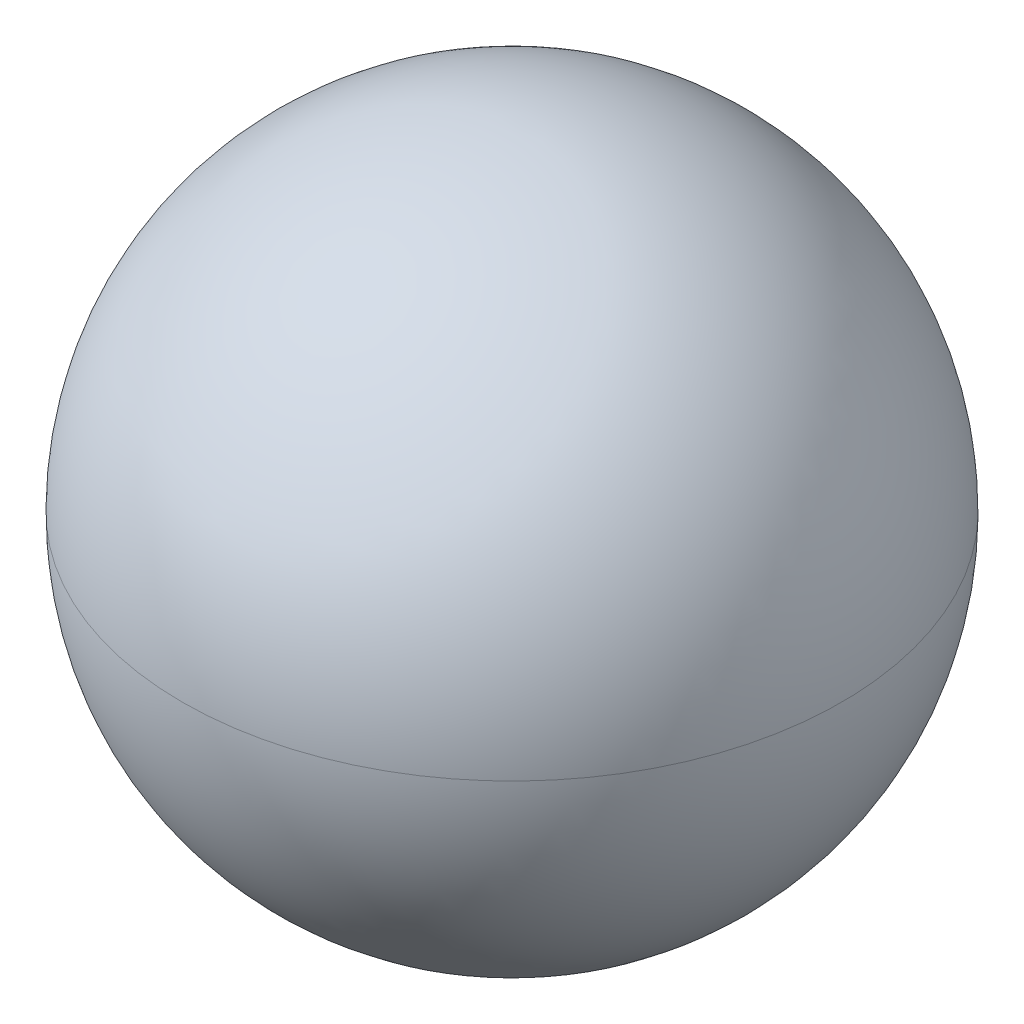
ISO-10303-21;
HEADER;
FILE_DESCRIPTION(('STEP AP214'),'2;1');
FILE_NAME('part.step','',(''),(''),'','','');
FILE_SCHEMA(('AUTOMOTIVE_DESIGN { 1 0 10303 214 1 1 1 1 }'));
ENDSEC;
DATA;
#1=APPLICATION_CONTEXT('core data for automotive mechanical design processes');
#2=APPLICATION_PROTOCOL_DEFINITION('international standard','automotive_design',2000,#1);
#3=PRODUCT_CONTEXT('',#1,'mechanical');
#4=PRODUCT('Part','Part','',(#3));
#5=PRODUCT_RELATED_PRODUCT_CATEGORY('part','',(#4));
#6=PRODUCT_DEFINITION_FORMATION('','',#4);
#7=PRODUCT_DEFINITION_CONTEXT('part definition',#1,'design');
#8=PRODUCT_DEFINITION('design','',#6,#7);
#9=PRODUCT_DEFINITION_SHAPE('','',#8);
#10=(LENGTH_UNIT() NAMED_UNIT(*) SI_UNIT(.MILLI.,.METRE.));
#11=(NAMED_UNIT(*) PLANE_ANGLE_UNIT() SI_UNIT($,.RADIAN.));
#12=(NAMED_UNIT(*) SI_UNIT($,.STERADIAN.) SOLID_ANGLE_UNIT());
#13=UNCERTAINTY_MEASURE_WITH_UNIT(LENGTH_MEASURE(1.E-05),#10,'distance_accuracy_value','');
#14=(GEOMETRIC_REPRESENTATION_CONTEXT(3) GLOBAL_UNCERTAINTY_ASSIGNED_CONTEXT((#13)) GLOBAL_UNIT_ASSIGNED_CONTEXT((#10,
#11,#12)) REPRESENTATION_CONTEXT('',''));
#15=CARTESIAN_POINT('',(0.,0.,0.));
#16=DIRECTION('',(0.,0.,1.));
#17=DIRECTION('',(1.,0.,0.));
#18=AXIS2_PLACEMENT_3D('',#15,#16,#17);
#19=CARTESIAN_POINT('',(0.,381.,0.));
#20=DIRECTION('',(0.,1.,0.));
#21=DIRECTION('',(0.,0.,1.));
#22=AXIS2_PLACEMENT_3D('',#19,#20,#21);
#23=SPHERICAL_SURFACE('',#22,381.);
#24=CARTESIAN_POINT('',(0.,381.,0.));
#25=DIRECTION('',(0.,-1.,0.));
#26=DIRECTION('',(0.,0.,-1.));
#27=AXIS2_PLACEMENT_3D('',#24,#25,#26);
#28=CIRCLE('',#27,381.);
#29=CARTESIAN_POINT('',(0.,381.,-381.));
#30=VERTEX_POINT('',#29);
#31=EDGE_CURVE('E48',#30,#30,#28,.T.);
#32=ORIENTED_EDGE('',*,*,#31,.F.);
#33=EDGE_LOOP('',(#32));
#34=FACE_BOUND('',#33,.T.);
#35=ADVANCED_FACE('F39',(#34),#23,.T.);
#36=CARTESIAN_POINT('',(0.,381.,0.));
#37=DIRECTION('',(0.,1.,0.));
#38=DIRECTION('',(0.,0.,1.));
#39=AXIS2_PLACEMENT_3D('',#36,#37,#38);
#40=SPHERICAL_SURFACE('',#39,381.);
#41=ORIENTED_EDGE('',*,*,#31,.T.);
#42=EDGE_LOOP('',(#41));
#43=FACE_BOUND('',#42,.T.);
#44=ADVANCED_FACE('F55',(#43),#40,.T.);
#45=CLOSED_SHELL('',(#35,#44));
#46=CARTESIAN_POINT('',(0.,381.,0.));
#47=DIRECTION('',(0.,1.,0.));
#48=DIRECTION('',(0.,0.,1.));
#49=AXIS2_PLACEMENT_3D('',#46,#47,#48);
#50=SPHERICAL_SURFACE('',#49,377.825);
#51=CARTESIAN_POINT('',(0.,381.,0.));
#52=DIRECTION('',(0.,1.,0.));
#53=DIRECTION('',(0.,0.,1.));
#54=AXIS2_PLACEMENT_3D('',#51,#52,#53);
#55=CIRCLE('',#54,377.825);
#56=CARTESIAN_POINT('',(0.,381.,377.825));
#57=VERTEX_POINT('',#56);
#58=EDGE_CURVE('E10',#57,#57,#55,.F.);
#59=ORIENTED_EDGE('',*,*,#58,.T.);
#60=EDGE_LOOP('',(#59));
#61=FACE_BOUND('',#60,.T.);
#62=ADVANCED_FACE('F63',(#61),#50,.F.);
#63=CARTESIAN_POINT('',(0.,381.,0.));
#64=DIRECTION('',(0.,1.,0.));
#65=DIRECTION('',(0.,0.,1.));
#66=AXIS2_PLACEMENT_3D('',#63,#64,#65);
#67=SPHERICAL_SURFACE('',#66,377.825);
#68=ORIENTED_EDGE('',*,*,#58,.F.);
#69=EDGE_LOOP('',(#68));
#70=FACE_BOUND('',#69,.T.);
#71=ADVANCED_FACE('F41',(#70),#67,.F.);
#72=CLOSED_SHELL('',(#62,#71));
#73=ORIENTED_CLOSED_SHELL('',*,#72,.T.);
#74=BREP_WITH_VOIDS('B2',#45,(#73));
#75=ADVANCED_BREP_SHAPE_REPRESENTATION('',(#18,#74),#14);
#76=SHAPE_DEFINITION_REPRESENTATION(#9,#75);
ENDSEC;
END-ISO-10303-21;
